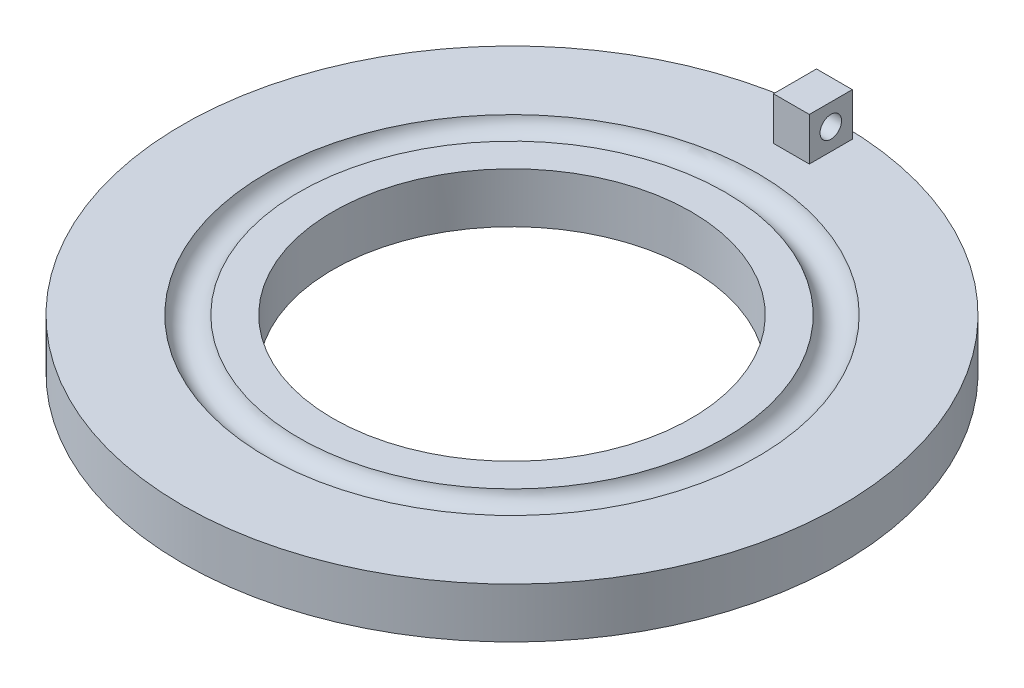
ISO-10303-21;
HEADER;
FILE_DESCRIPTION(('STEP AP214'),'2;1');
FILE_NAME('part.step','',(''),(''),'','','');
FILE_SCHEMA(('AUTOMOTIVE_DESIGN { 1 0 10303 214 1 1 1 1 }'));
ENDSEC;
DATA;
#1=APPLICATION_CONTEXT('core data for automotive mechanical design processes');
#2=APPLICATION_PROTOCOL_DEFINITION('international standard','automotive_design',2000,#1);
#3=PRODUCT_CONTEXT('',#1,'mechanical');
#4=PRODUCT('Part','Part','',(#3));
#5=PRODUCT_RELATED_PRODUCT_CATEGORY('part','',(#4));
#6=PRODUCT_DEFINITION_FORMATION('','',#4);
#7=PRODUCT_DEFINITION_CONTEXT('part definition',#1,'design');
#8=PRODUCT_DEFINITION('design','',#6,#7);
#9=PRODUCT_DEFINITION_SHAPE('','',#8);
#10=(LENGTH_UNIT() NAMED_UNIT(*) SI_UNIT(.MILLI.,.METRE.));
#11=(NAMED_UNIT(*) PLANE_ANGLE_UNIT() SI_UNIT($,.RADIAN.));
#12=(NAMED_UNIT(*) SI_UNIT($,.STERADIAN.) SOLID_ANGLE_UNIT());
#13=UNCERTAINTY_MEASURE_WITH_UNIT(LENGTH_MEASURE(1.E-05),#10,'distance_accuracy_value','');
#14=(GEOMETRIC_REPRESENTATION_CONTEXT(3) GLOBAL_UNCERTAINTY_ASSIGNED_CONTEXT((#13)) GLOBAL_UNIT_ASSIGNED_CONTEXT((#10,
#11,#12)) REPRESENTATION_CONTEXT('',''));
#15=CARTESIAN_POINT('',(0.,0.,0.));
#16=DIRECTION('',(0.,0.,1.));
#17=DIRECTION('',(1.,0.,0.));
#18=AXIS2_PLACEMENT_3D('',#15,#16,#17);
#19=CARTESIAN_POINT('',(-34.2706001409319,6.99999999999999,0.));
#20=DIRECTION('',(0.,-1.,0.));
#21=DIRECTION('',(0.,0.,-1.));
#22=AXIS2_PLACEMENT_3D('',#19,#20,#21);
#23=PLANE('',#22);
#24=CARTESIAN_POINT('',(0.,6.99999999999999,0.));
#25=DIRECTION('',(0.,-1.,0.));
#26=DIRECTION('',(0.,0.,-1.));
#27=AXIS2_PLACEMENT_3D('',#24,#25,#26);
#28=CIRCLE('',#27,34.2706001409319);
#29=CARTESIAN_POINT('',(0.,6.99999999999999,-34.2706001409319));
#30=VERTEX_POINT('',#29);
#31=EDGE_CURVE('E124',#30,#30,#28,.T.);
#32=ORIENTED_EDGE('',*,*,#31,.T.);
#33=EDGE_LOOP('',(#32));
#34=FACE_BOUND('',#33,.T.);
#35=CARTESIAN_POINT('',(0.,6.99999999999999,0.));
#36=DIRECTION('',(0.,-1.,0.));
#37=DIRECTION('',(0.,0.,-1.));
#38=AXIS2_PLACEMENT_3D('',#35,#36,#37);
#39=CIRCLE('',#38,46.);
#40=CARTESIAN_POINT('',(0.,6.99999999999999,-46.));
#41=VERTEX_POINT('',#40);
#42=EDGE_CURVE('E128',#41,#41,#39,.T.);
#43=ORIENTED_EDGE('',*,*,#42,.F.);
#44=EDGE_LOOP('',(#43));
#45=FACE_BOUND('',#44,.T.);
#46=DIRECTION('',(0.,0.,1.));
#47=VECTOR('',#46,1.);
#48=CARTESIAN_POINT('',(-2.5,6.99999999999999,0.));
#49=LINE('',#48,#47);
#50=CARTESIAN_POINT('',(-2.5,7.,-45.));
#51=VERTEX_POINT('',#50);
#52=CARTESIAN_POINT('',(-2.5,6.99999999999999,-39.));
#53=VERTEX_POINT('',#52);
#54=EDGE_CURVE('E11',#51,#53,#49,.T.);
#55=ORIENTED_EDGE('',*,*,#54,.F.);
#56=DIRECTION('',(-1.,0.,0.));
#57=VECTOR('',#56,1.);
#58=CARTESIAN_POINT('',(-34.2706001409319,6.99999999999999,-45.));
#59=LINE('',#58,#57);
#60=CARTESIAN_POINT('',(2.5,6.99999999999999,-45.));
#61=VERTEX_POINT('',#60);
#62=EDGE_CURVE('E144',#61,#51,#59,.T.);
#63=ORIENTED_EDGE('',*,*,#62,.F.);
#64=DIRECTION('',(0.,0.,-1.));
#65=VECTOR('',#64,1.);
#66=CARTESIAN_POINT('',(2.5,6.99999999999999,0.));
#67=LINE('',#66,#65);
#68=CARTESIAN_POINT('',(2.5,6.99999999999999,-39.));
#69=VERTEX_POINT('',#68);
#70=EDGE_CURVE('E65',#69,#61,#67,.T.);
#71=ORIENTED_EDGE('',*,*,#70,.F.);
#72=DIRECTION('',(1.,0.,0.));
#73=VECTOR('',#72,1.);
#74=CARTESIAN_POINT('',(-34.2706001409319,6.99999999999999,-39.));
#75=LINE('',#74,#73);
#76=EDGE_CURVE('E55',#53,#69,#75,.T.);
#77=ORIENTED_EDGE('',*,*,#76,.F.);
#78=EDGE_LOOP('',(#55,#63,#71,#77));
#79=FACE_BOUND('',#78,.T.);
#80=ADVANCED_FACE('F45',(#34,#45,#79),#23,.F.);
#81=CARTESIAN_POINT('',(0.,0.,0.));
#82=DIRECTION('',(0.,1.,0.));
#83=DIRECTION('',(0.,0.,1.));
#84=AXIS2_PLACEMENT_3D('',#81,#82,#83);
#85=PLANE('',#84);
#86=CARTESIAN_POINT('',(0.,0.,0.));
#87=DIRECTION('',(0.,1.,0.));
#88=DIRECTION('',(0.,0.,1.));
#89=AXIS2_PLACEMENT_3D('',#86,#87,#88);
#90=CIRCLE('',#89,25.);
#91=CARTESIAN_POINT('',(0.,0.,25.));
#92=VERTEX_POINT('',#91);
#93=EDGE_CURVE('E109',#92,#92,#90,.T.);
#94=ORIENTED_EDGE('',*,*,#93,.T.);
#95=EDGE_LOOP('',(#94));
#96=FACE_BOUND('',#95,.T.);
#97=CARTESIAN_POINT('',(0.,0.,0.));
#98=DIRECTION('',(0.,-1.,0.));
#99=DIRECTION('',(0.,0.,-1.));
#100=AXIS2_PLACEMENT_3D('',#97,#98,#99);
#101=CIRCLE('',#100,29.7293998590681);
#102=CARTESIAN_POINT('',(0.,0.,-29.7293998590681));
#103=VERTEX_POINT('',#102);
#104=EDGE_CURVE('E140',#103,#103,#101,.T.);
#105=ORIENTED_EDGE('',*,*,#104,.T.);
#106=EDGE_LOOP('',(#105));
#107=FACE_BOUND('',#106,.T.);
#108=ADVANCED_FACE('F47',(#96,#107),#85,.F.);
#109=CARTESIAN_POINT('',(0.,-0.500000000000004,0.));
#110=DIRECTION('',(0.,-1.,0.));
#111=DIRECTION('',(0.,0.,-1.));
#112=AXIS2_PLACEMENT_3D('',#109,#110,#111);
#113=TOROIDAL_SURFACE('',#112,32.,2.325);
#114=ORIENTED_EDGE('',*,*,#104,.F.);
#115=EDGE_LOOP('',(#114));
#116=FACE_BOUND('',#115,.T.);
#117=CARTESIAN_POINT('',(0.,0.,0.));
#118=DIRECTION('',(0.,-1.,0.));
#119=DIRECTION('',(0.,0.,-1.));
#120=AXIS2_PLACEMENT_3D('',#117,#118,#119);
#121=CIRCLE('',#120,34.2706001409319);
#122=CARTESIAN_POINT('',(0.,0.,-34.2706001409319));
#123=VERTEX_POINT('',#122);
#124=EDGE_CURVE('E136',#123,#123,#121,.T.);
#125=ORIENTED_EDGE('',*,*,#124,.T.);
#126=EDGE_LOOP('',(#125));
#127=FACE_BOUND('',#126,.T.);
#128=ADVANCED_FACE('F176',(#116,#127),#113,.F.);
#129=CARTESIAN_POINT('',(-34.2706001409319,0.,0.));
#130=DIRECTION('',(0.,1.,0.));
#131=DIRECTION('',(0.,0.,1.));
#132=AXIS2_PLACEMENT_3D('',#129,#130,#131);
#133=PLANE('',#132);
#134=CARTESIAN_POINT('',(0.,0.,0.));
#135=DIRECTION('',(0.,-1.,0.));
#136=DIRECTION('',(0.,0.,-1.));
#137=AXIS2_PLACEMENT_3D('',#134,#135,#136);
#138=CIRCLE('',#137,46.);
#139=CARTESIAN_POINT('',(0.,0.,-46.));
#140=VERTEX_POINT('',#139);
#141=EDGE_CURVE('E132',#140,#140,#138,.T.);
#142=ORIENTED_EDGE('',*,*,#141,.T.);
#143=EDGE_LOOP('',(#142));
#144=FACE_BOUND('',#143,.T.);
#145=ORIENTED_EDGE('',*,*,#124,.F.);
#146=EDGE_LOOP('',(#145));
#147=FACE_BOUND('',#146,.T.);
#148=ADVANCED_FACE('F186',(#144,#147),#133,.F.);
#149=CARTESIAN_POINT('',(0.,0.,0.));
#150=DIRECTION('',(0.,-1.,0.));
#151=DIRECTION('',(0.,0.,-1.));
#152=AXIS2_PLACEMENT_3D('',#149,#150,#151);
#153=CYLINDRICAL_SURFACE('',#152,46.);
#154=ORIENTED_EDGE('',*,*,#141,.F.);
#155=EDGE_LOOP('',(#154));
#156=FACE_BOUND('',#155,.T.);
#157=ORIENTED_EDGE('',*,*,#42,.T.);
#158=EDGE_LOOP('',(#157));
#159=FACE_BOUND('',#158,.T.);
#160=ADVANCED_FACE('F183',(#156,#159),#153,.T.);
#161=CARTESIAN_POINT('',(0.,7.49999999999999,0.));
#162=DIRECTION('',(0.,-1.,0.));
#163=DIRECTION('',(0.,0.,-1.));
#164=AXIS2_PLACEMENT_3D('',#161,#162,#163);
#165=TOROIDAL_SURFACE('',#164,32.,2.325);
#166=ORIENTED_EDGE('',*,*,#31,.F.);
#167=EDGE_LOOP('',(#166));
#168=FACE_BOUND('',#167,.T.);
#169=CARTESIAN_POINT('',(0.,6.99999999999999,0.));
#170=DIRECTION('',(0.,-1.,0.));
#171=DIRECTION('',(0.,0.,-1.));
#172=AXIS2_PLACEMENT_3D('',#169,#170,#171);
#173=CIRCLE('',#172,29.7293998590681);
#174=CARTESIAN_POINT('',(0.,6.99999999999999,-29.7293998590681));
#175=VERTEX_POINT('',#174);
#176=EDGE_CURVE('E120',#175,#175,#173,.T.);
#177=ORIENTED_EDGE('',*,*,#176,.T.);
#178=EDGE_LOOP('',(#177));
#179=FACE_BOUND('',#178,.T.);
#180=ADVANCED_FACE('F181',(#168,#179),#165,.F.);
#181=CARTESIAN_POINT('',(0.,6.99999999999999,0.));
#182=DIRECTION('',(0.,-1.,0.));
#183=DIRECTION('',(0.,0.,-1.));
#184=AXIS2_PLACEMENT_3D('',#181,#182,#183);
#185=PLANE('',#184);
#186=CARTESIAN_POINT('',(0.,6.99999999999999,0.));
#187=DIRECTION('',(0.,-1.,0.));
#188=DIRECTION('',(0.,0.,-1.));
#189=AXIS2_PLACEMENT_3D('',#186,#187,#188);
#190=CIRCLE('',#189,25.);
#191=CARTESIAN_POINT('',(0.,6.99999999999999,-25.));
#192=VERTEX_POINT('',#191);
#193=EDGE_CURVE('E114',#192,#192,#190,.T.);
#194=ORIENTED_EDGE('',*,*,#193,.T.);
#195=EDGE_LOOP('',(#194));
#196=FACE_BOUND('',#195,.T.);
#197=ORIENTED_EDGE('',*,*,#176,.F.);
#198=EDGE_LOOP('',(#197));
#199=FACE_BOUND('',#198,.T.);
#200=ADVANCED_FACE('F211',(#196,#199),#185,.F.);
#201=CARTESIAN_POINT('',(0.,0.,0.));
#202=DIRECTION('',(0.,1.,0.));
#203=DIRECTION('',(0.,0.,1.));
#204=AXIS2_PLACEMENT_3D('',#201,#202,#203);
#205=CYLINDRICAL_SURFACE('',#204,25.);
#206=ORIENTED_EDGE('',*,*,#93,.F.);
#207=EDGE_LOOP('',(#206));
#208=FACE_BOUND('',#207,.T.);
#209=ORIENTED_EDGE('',*,*,#193,.F.);
#210=EDGE_LOOP('',(#209));
#211=FACE_BOUND('',#210,.T.);
#212=ADVANCED_FACE('F223',(#208,#211),#205,.F.);
#213=CARTESIAN_POINT('',(-2.5,13.,-39.));
#214=DIRECTION('',(1.,0.,0.));
#215=DIRECTION('',(0.,0.,-1.));
#216=AXIS2_PLACEMENT_3D('',#213,#214,#215);
#217=PLANE('',#216);
#218=CARTESIAN_POINT('',(-2.5,10.,-42.));
#219=DIRECTION('',(1.,0.,0.));
#220=DIRECTION('',(0.,0.,-1.));
#221=AXIS2_PLACEMENT_3D('',#218,#219,#220);
#222=CIRCLE('',#221,1.5);
#223=CARTESIAN_POINT('',(-2.5,10.,-43.5));
#224=VERTEX_POINT('',#223);
#225=EDGE_CURVE('E105',#224,#224,#222,.T.);
#226=ORIENTED_EDGE('',*,*,#225,.T.);
#227=EDGE_LOOP('',(#226));
#228=FACE_BOUND('',#227,.T.);
#229=DIRECTION('',(0.,-1.,0.));
#230=VECTOR('',#229,1.);
#231=CARTESIAN_POINT('',(-2.5,13.,-45.));
#232=LINE('',#231,#230);
#233=CARTESIAN_POINT('',(-2.5,13.,-45.));
#234=VERTEX_POINT('',#233);
#235=EDGE_CURVE('E161',#234,#51,#232,.T.);
#236=ORIENTED_EDGE('',*,*,#235,.T.);
#237=ORIENTED_EDGE('',*,*,#54,.T.);
#238=DIRECTION('',(0.,-1.,0.));
#239=VECTOR('',#238,1.);
#240=CARTESIAN_POINT('',(-2.5,13.,-39.));
#241=LINE('',#240,#239);
#242=CARTESIAN_POINT('',(-2.5,13.,-39.));
#243=VERTEX_POINT('',#242);
#244=EDGE_CURVE('E88',#243,#53,#241,.T.);
#245=ORIENTED_EDGE('',*,*,#244,.F.);
#246=DIRECTION('',(0.,0.,1.));
#247=VECTOR('',#246,1.);
#248=CARTESIAN_POINT('',(-2.5,13.,-39.));
#249=LINE('',#248,#247);
#250=EDGE_CURVE('E95',#234,#243,#249,.T.);
#251=ORIENTED_EDGE('',*,*,#250,.F.);
#252=EDGE_LOOP('',(#236,#237,#245,#251));
#253=FACE_BOUND('',#252,.T.);
#254=ADVANCED_FACE('F107',(#228,#253),#217,.F.);
#255=CARTESIAN_POINT('',(-2.5,13.,-39.));
#256=DIRECTION('',(0.,0.,-1.));
#257=DIRECTION('',(-1.,0.,0.));
#258=AXIS2_PLACEMENT_3D('',#255,#256,#257);
#259=PLANE('',#258);
#260=ORIENTED_EDGE('',*,*,#244,.T.);
#261=ORIENTED_EDGE('',*,*,#76,.T.);
#262=DIRECTION('',(0.,-1.,0.));
#263=VECTOR('',#262,1.);
#264=CARTESIAN_POINT('',(2.5,13.,-39.));
#265=LINE('',#264,#263);
#266=CARTESIAN_POINT('',(2.5,13.,-39.));
#267=VERTEX_POINT('',#266);
#268=EDGE_CURVE('E90',#267,#69,#265,.T.);
#269=ORIENTED_EDGE('',*,*,#268,.F.);
#270=DIRECTION('',(1.,0.,0.));
#271=VECTOR('',#270,1.);
#272=CARTESIAN_POINT('',(-2.5,13.,-39.));
#273=LINE('',#272,#271);
#274=EDGE_CURVE('E84',#243,#267,#273,.T.);
#275=ORIENTED_EDGE('',*,*,#274,.F.);
#276=EDGE_LOOP('',(#260,#261,#269,#275));
#277=FACE_BOUND('',#276,.T.);
#278=ADVANCED_FACE('F86',(#277),#259,.F.);
#279=CARTESIAN_POINT('',(2.5,13.,-39.));
#280=DIRECTION('',(-1.,0.,0.));
#281=DIRECTION('',(0.,0.,1.));
#282=AXIS2_PLACEMENT_3D('',#279,#280,#281);
#283=PLANE('',#282);
#284=CARTESIAN_POINT('',(2.5,10.,-42.));
#285=DIRECTION('',(-1.,0.,0.));
#286=DIRECTION('',(0.,0.,1.));
#287=AXIS2_PLACEMENT_3D('',#284,#285,#286);
#288=CIRCLE('',#287,1.5);
#289=CARTESIAN_POINT('',(2.5,10.,-43.5));
#290=VERTEX_POINT('',#289);
#291=EDGE_CURVE('E49',#290,#290,#288,.T.);
#292=ORIENTED_EDGE('',*,*,#291,.T.);
#293=EDGE_LOOP('',(#292));
#294=FACE_BOUND('',#293,.T.);
#295=ORIENTED_EDGE('',*,*,#268,.T.);
#296=ORIENTED_EDGE('',*,*,#70,.T.);
#297=DIRECTION('',(0.,-1.,0.));
#298=VECTOR('',#297,1.);
#299=CARTESIAN_POINT('',(2.5,13.,-45.));
#300=LINE('',#299,#298);
#301=CARTESIAN_POINT('',(2.5,13.,-45.));
#302=VERTEX_POINT('',#301);
#303=EDGE_CURVE('E116',#302,#61,#300,.T.);
#304=ORIENTED_EDGE('',*,*,#303,.F.);
#305=DIRECTION('',(0.,0.,-1.));
#306=VECTOR('',#305,1.);
#307=CARTESIAN_POINT('',(2.5,13.,-39.));
#308=LINE('',#307,#306);
#309=EDGE_CURVE('E94',#267,#302,#308,.T.);
#310=ORIENTED_EDGE('',*,*,#309,.F.);
#311=EDGE_LOOP('',(#295,#296,#304,#310));
#312=FACE_BOUND('',#311,.T.);
#313=ADVANCED_FACE('F155',(#294,#312),#283,.F.);
#314=CARTESIAN_POINT('',(-2.5,13.,-45.));
#315=DIRECTION('',(0.,0.,1.));
#316=DIRECTION('',(1.,0.,0.));
#317=AXIS2_PLACEMENT_3D('',#314,#315,#316);
#318=PLANE('',#317);
#319=ORIENTED_EDGE('',*,*,#303,.T.);
#320=ORIENTED_EDGE('',*,*,#62,.T.);
#321=ORIENTED_EDGE('',*,*,#235,.F.);
#322=DIRECTION('',(-1.,0.,0.));
#323=VECTOR('',#322,1.);
#324=CARTESIAN_POINT('',(-2.5,13.,-45.));
#325=LINE('',#324,#323);
#326=EDGE_CURVE('E100',#302,#234,#325,.T.);
#327=ORIENTED_EDGE('',*,*,#326,.F.);
#328=EDGE_LOOP('',(#319,#320,#321,#327));
#329=FACE_BOUND('',#328,.T.);
#330=ADVANCED_FACE('F167',(#329),#318,.F.);
#331=CARTESIAN_POINT('',(0.,13.,0.));
#332=DIRECTION('',(0.,-1.,0.));
#333=DIRECTION('',(0.,0.,-1.));
#334=AXIS2_PLACEMENT_3D('',#331,#332,#333);
#335=PLANE('',#334);
#336=ORIENTED_EDGE('',*,*,#250,.T.);
#337=ORIENTED_EDGE('',*,*,#274,.T.);
#338=ORIENTED_EDGE('',*,*,#309,.T.);
#339=ORIENTED_EDGE('',*,*,#326,.T.);
#340=EDGE_LOOP('',(#336,#337,#338,#339));
#341=FACE_BOUND('',#340,.T.);
#342=ADVANCED_FACE('F98',(#341),#335,.F.);
#343=CARTESIAN_POINT('',(-46.,10.,-42.));
#344=DIRECTION('',(1.,0.,0.));
#345=DIRECTION('',(0.,0.,-1.));
#346=AXIS2_PLACEMENT_3D('',#343,#344,#345);
#347=CYLINDRICAL_SURFACE('',#346,1.5);
#348=CARTESIAN_POINT('',(2.5,10.,-43.5));
#349=CARTESIAN_POINT('',(2.44791666666667,10.,-43.5));
#350=CARTESIAN_POINT('',(2.39583333333334,10.,-43.5));
#351=CARTESIAN_POINT('',(2.29166666666667,10.,-43.5));
#352=CARTESIAN_POINT('',(2.23958333333334,10.,-43.5));
#353=CARTESIAN_POINT('',(2.13541666666667,10.,-43.5));
#354=CARTESIAN_POINT('',(2.08333333333333,10.,-43.5));
#355=CARTESIAN_POINT('',(1.97916666666667,10.,-43.5));
#356=CARTESIAN_POINT('',(1.92708333333333,10.,-43.5));
#357=CARTESIAN_POINT('',(1.82291666666667,10.,-43.5));
#358=CARTESIAN_POINT('',(1.77083333333334,10.,-43.5));
#359=CARTESIAN_POINT('',(1.66666666666667,10.,-43.5));
#360=CARTESIAN_POINT('',(1.61458333333334,10.,-43.5));
#361=CARTESIAN_POINT('',(1.51041666666667,10.,-43.5));
#362=CARTESIAN_POINT('',(1.45833333333333,10.,-43.5));
#363=CARTESIAN_POINT('',(1.35416666666667,10.,-43.5));
#364=CARTESIAN_POINT('',(1.30208333333333,10.,-43.5));
#365=CARTESIAN_POINT('',(1.19791666666667,10.,-43.5));
#366=CARTESIAN_POINT('',(1.14583333333334,10.,-43.5));
#367=CARTESIAN_POINT('',(1.04166666666667,10.,-43.5));
#368=CARTESIAN_POINT('',(0.989583333333335,10.,-43.5));
#369=CARTESIAN_POINT('',(0.885416666666666,10.,-43.5));
#370=CARTESIAN_POINT('',(0.833333333333332,10.,-43.5));
#371=CARTESIAN_POINT('',(0.729166666666665,10.,-43.5));
#372=CARTESIAN_POINT('',(0.677083333333333,10.,-43.5));
#373=CARTESIAN_POINT('',(0.572916666666668,10.,-43.5));
#374=CARTESIAN_POINT('',(0.520833333333336,10.,-43.5));
#375=CARTESIAN_POINT('',(0.416666666666669,10.,-43.5));
#376=CARTESIAN_POINT('',(0.364583333333335,10.,-43.5));
#377=CARTESIAN_POINT('',(0.260416666666666,10.,-43.5));
#378=CARTESIAN_POINT('',(0.208333333333331,10.,-43.5));
#379=CARTESIAN_POINT('',(0.104166666666664,10.,-43.5));
#380=CARTESIAN_POINT('',(0.0520833333333322,10.,-43.5));
#381=CARTESIAN_POINT('',(-0.0520833333333322,10.,-43.5));
#382=CARTESIAN_POINT('',(-0.104166666666664,10.,-43.5));
#383=CARTESIAN_POINT('',(-0.208333333333331,10.,-43.5));
#384=CARTESIAN_POINT('',(-0.260416666666666,10.,-43.5));
#385=CARTESIAN_POINT('',(-0.364583333333335,10.,-43.5));
#386=CARTESIAN_POINT('',(-0.416666666666669,10.,-43.5));
#387=CARTESIAN_POINT('',(-0.520833333333336,10.,-43.5));
#388=CARTESIAN_POINT('',(-0.572916666666668,10.,-43.5));
#389=CARTESIAN_POINT('',(-0.677083333333333,10.,-43.5));
#390=CARTESIAN_POINT('',(-0.729166666666665,10.,-43.5));
#391=CARTESIAN_POINT('',(-0.833333333333332,10.,-43.5));
#392=CARTESIAN_POINT('',(-0.885416666666666,10.,-43.5));
#393=CARTESIAN_POINT('',(-0.989583333333335,10.,-43.5));
#394=CARTESIAN_POINT('',(-1.04166666666667,10.,-43.5));
#395=CARTESIAN_POINT('',(-1.14583333333334,10.,-43.5));
#396=CARTESIAN_POINT('',(-1.19791666666667,10.,-43.5));
#397=CARTESIAN_POINT('',(-1.30208333333333,10.,-43.5));
#398=CARTESIAN_POINT('',(-1.35416666666667,10.,-43.5));
#399=CARTESIAN_POINT('',(-1.45833333333333,10.,-43.5));
#400=CARTESIAN_POINT('',(-1.51041666666667,10.,-43.5));
#401=CARTESIAN_POINT('',(-1.61458333333334,10.,-43.5));
#402=CARTESIAN_POINT('',(-1.66666666666667,10.,-43.5));
#403=CARTESIAN_POINT('',(-1.77083333333334,10.,-43.5));
#404=CARTESIAN_POINT('',(-1.82291666666667,10.,-43.5));
#405=CARTESIAN_POINT('',(-1.92708333333333,10.,-43.5));
#406=CARTESIAN_POINT('',(-1.97916666666667,10.,-43.5));
#407=CARTESIAN_POINT('',(-2.08333333333333,10.,-43.5));
#408=CARTESIAN_POINT('',(-2.13541666666667,10.,-43.5));
#409=CARTESIAN_POINT('',(-2.23958333333334,10.,-43.5));
#410=CARTESIAN_POINT('',(-2.29166666666667,10.,-43.5));
#411=CARTESIAN_POINT('',(-2.39583333333334,10.,-43.5));
#412=CARTESIAN_POINT('',(-2.44791666666667,10.,-43.5));
#413=CARTESIAN_POINT('',(-2.5,10.,-43.5));
#414=B_SPLINE_CURVE_WITH_KNOTS('',3,(#348,#349,#350,#351,#352,#353,#354,#355,#356,#357,#358,
#359,#360,#361,#362,#363,#364,#365,#366,#367,#368,#369,#370,#371,#372,#373,#374,#375,#376,#377,
#378,#379,#380,#381,#382,#383,#384,#385,#386,#387,#388,#389,#390,#391,#392,#393,#394,#395,#396,
#397,#398,#399,#400,#401,#402,#403,#404,#405,#406,#407,#408,#409,#410,#411,#412,#413),
.UNSPECIFIED.,.F.,.F.,(4,2,2,2,2,2,2,2,2,2,2,2,2,2,2,2,2,2,2,2,2,2,2,2,2,2,2,2,2,2,2,2,4),(0.,
0.156249999999997,0.3125,0.468750000000004,0.625000000000001,0.781249999999997,
0.937500000000001,1.09375,1.25,1.40625,1.5625,1.71875,1.875,2.03125,2.1875,2.34375000000001,2.5,
2.65625,2.8125,2.96875000000001,3.125,3.28125,3.4375,3.59375000000001,3.75,3.90625,4.0625,
4.21875000000001,4.375,4.53125,4.6875,4.84375000000001,5.),.UNSPECIFIED.);
#415=EDGE_CURVE('BSEAM281',#290,#224,#414,.T.);
#416=ORIENTED_EDGE('',*,*,#291,.F.);
#417=ORIENTED_EDGE('',*,*,#225,.F.);
#418=ORIENTED_EDGE('',*,*,#415,.T.);
#419=ORIENTED_EDGE('',*,*,#415,.F.);
#420=EDGE_LOOP('',(#416,#418,#417,#419));
#421=FACE_BOUND('',#420,.T.);
#422=ADVANCED_FACE('F281',(#421),#347,.F.);
#423=CLOSED_SHELL('',(#80,#108,#128,#148,#160,#180,#200,#212,#254,#278,#313,#330,#342,#422));
#424=MANIFOLD_SOLID_BREP('B2',#423);
#425=ADVANCED_BREP_SHAPE_REPRESENTATION('',(#18,#424),#14);
#426=SHAPE_DEFINITION_REPRESENTATION(#9,#425);
ENDSEC;
END-ISO-10303-21;
